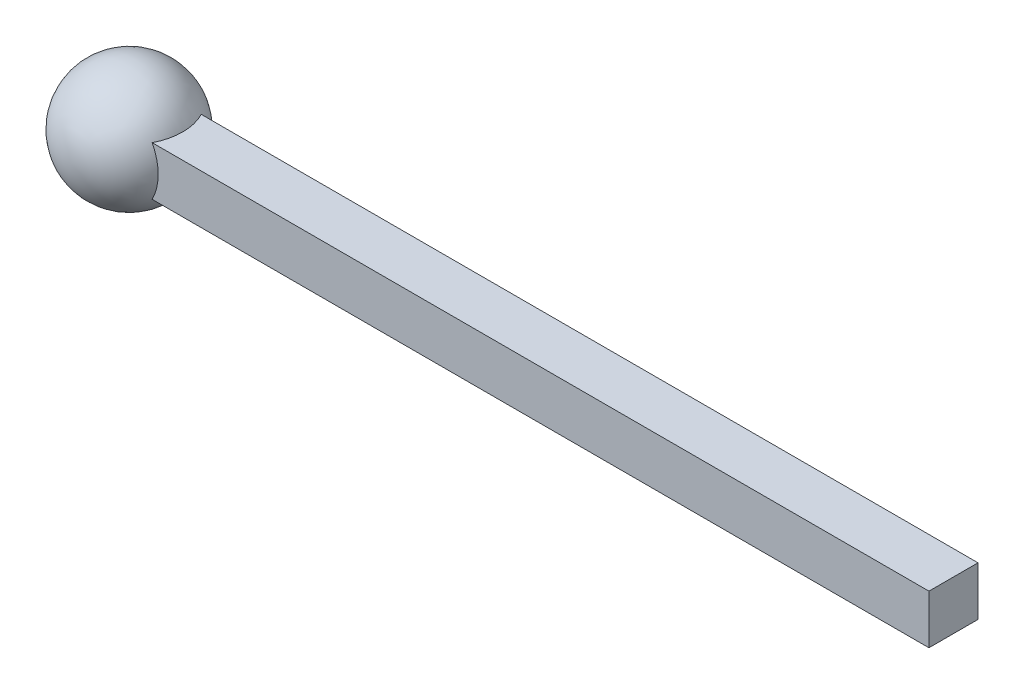
ISO-10303-21;
HEADER;
FILE_DESCRIPTION(('STEP AP214'),'2;1');
FILE_NAME('part.step','',(''),(''),'','','');
FILE_SCHEMA(('AUTOMOTIVE_DESIGN { 1 0 10303 214 1 1 1 1 }'));
ENDSEC;
DATA;
#1=APPLICATION_CONTEXT('core data for automotive mechanical design processes');
#2=APPLICATION_PROTOCOL_DEFINITION('international standard','automotive_design',2000,#1);
#3=PRODUCT_CONTEXT('',#1,'mechanical');
#4=PRODUCT('Part','Part','',(#3));
#5=PRODUCT_RELATED_PRODUCT_CATEGORY('part','',(#4));
#6=PRODUCT_DEFINITION_FORMATION('','',#4);
#7=PRODUCT_DEFINITION_CONTEXT('part definition',#1,'design');
#8=PRODUCT_DEFINITION('design','',#6,#7);
#9=PRODUCT_DEFINITION_SHAPE('','',#8);
#10=(LENGTH_UNIT() NAMED_UNIT(*) SI_UNIT(.MILLI.,.METRE.));
#11=(NAMED_UNIT(*) PLANE_ANGLE_UNIT() SI_UNIT($,.RADIAN.));
#12=(NAMED_UNIT(*) SI_UNIT($,.STERADIAN.) SOLID_ANGLE_UNIT());
#13=UNCERTAINTY_MEASURE_WITH_UNIT(LENGTH_MEASURE(1.E-05),#10,'distance_accuracy_value','');
#14=(GEOMETRIC_REPRESENTATION_CONTEXT(3) GLOBAL_UNCERTAINTY_ASSIGNED_CONTEXT((#13)) GLOBAL_UNIT_ASSIGNED_CONTEXT((#10,
#11,#12)) REPRESENTATION_CONTEXT('',''));
#15=CARTESIAN_POINT('',(0.,0.,0.));
#16=DIRECTION('',(0.,0.,1.));
#17=DIRECTION('',(1.,0.,0.));
#18=AXIS2_PLACEMENT_3D('',#15,#16,#17);
#19=CARTESIAN_POINT('',(561.061227952796,38.1,-190.5));
#20=DIRECTION('',(-1.,0.,0.));
#21=DIRECTION('',(0.,0.,1.));
#22=AXIS2_PLACEMENT_3D('',#19,#20,#21);
#23=PLANE('',#22);
#24=DIRECTION('',(0.,0.,1.));
#25=VECTOR('',#24,1.);
#26=CARTESIAN_POINT('',(561.061227952796,13.6071428571429,-166.007142857143));
#27=LINE('',#26,#25);
#28=CARTESIAN_POINT('',(561.061227952796,13.6071428571429,-166.007142857143));
#29=VERTEX_POINT('',#28);
#30=CARTESIAN_POINT('',(561.061227952796,13.6071428571428,-138.792857142857));
#31=VERTEX_POINT('',#30);
#32=EDGE_CURVE('E11',#29,#31,#27,.T.);
#33=ORIENTED_EDGE('',*,*,#32,.T.);
#34=DIRECTION('',(0.,-1.,0.));
#35=VECTOR('',#34,1.);
#36=CARTESIAN_POINT('',(561.061227952796,13.6071428571428,-138.792857142857));
#37=LINE('',#36,#35);
#38=CARTESIAN_POINT('',(561.061227952796,-13.6071428571429,-138.792857142857));
#39=VERTEX_POINT('',#38);
#40=EDGE_CURVE('E43',#31,#39,#37,.T.);
#41=ORIENTED_EDGE('',*,*,#40,.T.);
#42=DIRECTION('',(0.,0.,-1.));
#43=VECTOR('',#42,1.);
#44=CARTESIAN_POINT('',(561.061227952796,-13.6071428571429,-138.792857142857));
#45=LINE('',#44,#43);
#46=CARTESIAN_POINT('',(561.061227952796,-13.6071428571429,-166.007142857143));
#47=VERTEX_POINT('',#46);
#48=EDGE_CURVE('E51',#39,#47,#45,.T.);
#49=ORIENTED_EDGE('',*,*,#48,.T.);
#50=DIRECTION('',(0.,1.,0.));
#51=VECTOR('',#50,1.);
#52=CARTESIAN_POINT('',(561.061227952796,-13.6071428571429,-166.007142857143));
#53=LINE('',#52,#51);
#54=EDGE_CURVE('E93',#47,#29,#53,.T.);
#55=ORIENTED_EDGE('',*,*,#54,.T.);
#56=EDGE_LOOP('',(#33,#41,#49,#55));
#57=FACE_BOUND('',#56,.T.);
#58=ADVANCED_FACE('F35',(#57),#23,.F.);
#59=CARTESIAN_POINT('',(103.861227952796,0.,-152.4));
#60=DIRECTION('',(0.,0.,1.));
#61=DIRECTION('',(-1.,0.,0.));
#62=AXIS2_PLACEMENT_3D('',#59,#60,#61);
#63=SPHERICAL_SURFACE('',#62,32.6571428571429);
#64=CARTESIAN_POINT('',(103.861227952796,13.6071428571428,-152.4));
#65=DIRECTION('',(0.,1.,0.));
#66=DIRECTION('',(0.,0.,1.));
#67=AXIS2_PLACEMENT_3D('',#64,#65,#66);
#68=CIRCLE('',#67,29.6872808262586);
#69=CARTESIAN_POINT('',(130.246456891019,13.6071428571428,-138.792857142857));
#70=VERTEX_POINT('',#69);
#71=CARTESIAN_POINT('',(130.246456891019,13.6071428571429,-166.007142857143));
#72=VERTEX_POINT('',#71);
#73=EDGE_CURVE('E38',#70,#72,#68,.T.);
#74=ORIENTED_EDGE('',*,*,#73,.T.);
#75=CARTESIAN_POINT('',(103.861227952796,0.,-166.007142857143));
#76=DIRECTION('',(0.,0.,-1.));
#77=DIRECTION('',(-1.,0.,0.));
#78=AXIS2_PLACEMENT_3D('',#75,#76,#77);
#79=CIRCLE('',#78,29.6872808262586);
#80=CARTESIAN_POINT('',(130.246456891019,-13.6071428571429,-166.007142857143));
#81=VERTEX_POINT('',#80);
#82=EDGE_CURVE('E83',#72,#81,#79,.T.);
#83=ORIENTED_EDGE('',*,*,#82,.T.);
#84=CARTESIAN_POINT('',(103.861227952796,-13.6071428571429,-152.4));
#85=DIRECTION('',(0.,-1.,0.));
#86=DIRECTION('',(0.,0.,-1.));
#87=AXIS2_PLACEMENT_3D('',#84,#85,#86);
#88=CIRCLE('',#87,29.6872808262586);
#89=CARTESIAN_POINT('',(130.246456891019,-13.6071428571429,-138.792857142857));
#90=VERTEX_POINT('',#89);
#91=EDGE_CURVE('E77',#81,#90,#88,.T.);
#92=ORIENTED_EDGE('',*,*,#91,.T.);
#93=CARTESIAN_POINT('',(103.861227952796,0.,-138.792857142857));
#94=DIRECTION('',(0.,0.,1.));
#95=DIRECTION('',(0.,-1.,0.));
#96=AXIS2_PLACEMENT_3D('',#93,#94,#95);
#97=CIRCLE('',#96,29.6872808262586);
#98=EDGE_CURVE('E80',#90,#70,#97,.T.);
#99=ORIENTED_EDGE('',*,*,#98,.T.);
#100=EDGE_LOOP('',(#74,#83,#92,#99));
#101=FACE_BOUND('',#100,.T.);
#102=ADVANCED_FACE('F78',(#101),#63,.T.);
#103=CARTESIAN_POINT('',(71.2038708099387,13.6071428571429,-166.007142857143));
#104=DIRECTION('',(0.,1.,0.));
#105=DIRECTION('',(0.,0.,1.));
#106=AXIS2_PLACEMENT_3D('',#103,#104,#105);
#107=PLANE('',#106);
#108=ORIENTED_EDGE('',*,*,#73,.F.);
#109=DIRECTION('',(1.,0.,0.));
#110=VECTOR('',#109,1.);
#111=CARTESIAN_POINT('',(71.2038708099387,13.6071428571428,-138.792857142857));
#112=LINE('',#111,#110);
#113=EDGE_CURVE('E92',#70,#31,#112,.T.);
#114=ORIENTED_EDGE('',*,*,#113,.T.);
#115=ORIENTED_EDGE('',*,*,#32,.F.);
#116=DIRECTION('',(1.,0.,0.));
#117=VECTOR('',#116,1.);
#118=CARTESIAN_POINT('',(71.2038708099387,13.6071428571429,-166.007142857143));
#119=LINE('',#118,#117);
#120=EDGE_CURVE('E102',#72,#29,#119,.T.);
#121=ORIENTED_EDGE('',*,*,#120,.F.);
#122=EDGE_LOOP('',(#108,#114,#115,#121));
#123=FACE_BOUND('',#122,.T.);
#124=ADVANCED_FACE('F104',(#123),#107,.T.);
#125=CARTESIAN_POINT('',(71.2038708099387,-13.6071428571429,-166.007142857143));
#126=DIRECTION('',(0.,0.,-1.));
#127=DIRECTION('',(-1.,0.,0.));
#128=AXIS2_PLACEMENT_3D('',#125,#126,#127);
#129=PLANE('',#128);
#130=ORIENTED_EDGE('',*,*,#82,.F.);
#131=ORIENTED_EDGE('',*,*,#120,.T.);
#132=ORIENTED_EDGE('',*,*,#54,.F.);
#133=DIRECTION('',(1.,0.,0.));
#134=VECTOR('',#133,1.);
#135=CARTESIAN_POINT('',(71.2038708099387,-13.6071428571429,-166.007142857143));
#136=LINE('',#135,#134);
#137=EDGE_CURVE('E88',#81,#47,#136,.T.);
#138=ORIENTED_EDGE('',*,*,#137,.F.);
#139=EDGE_LOOP('',(#130,#131,#132,#138));
#140=FACE_BOUND('',#139,.T.);
#141=ADVANCED_FACE('F101',(#140),#129,.T.);
#142=CARTESIAN_POINT('',(71.2038708099387,-13.6071428571429,-138.792857142857));
#143=DIRECTION('',(0.,-1.,0.));
#144=DIRECTION('',(0.,0.,-1.));
#145=AXIS2_PLACEMENT_3D('',#142,#143,#144);
#146=PLANE('',#145);
#147=ORIENTED_EDGE('',*,*,#91,.F.);
#148=ORIENTED_EDGE('',*,*,#137,.T.);
#149=ORIENTED_EDGE('',*,*,#48,.F.);
#150=DIRECTION('',(1.,0.,0.));
#151=VECTOR('',#150,1.);
#152=CARTESIAN_POINT('',(71.2038708099387,-13.6071428571429,-138.792857142857));
#153=LINE('',#152,#151);
#154=EDGE_CURVE('E86',#90,#39,#153,.T.);
#155=ORIENTED_EDGE('',*,*,#154,.F.);
#156=EDGE_LOOP('',(#147,#148,#149,#155));
#157=FACE_BOUND('',#156,.T.);
#158=ADVANCED_FACE('F87',(#157),#146,.T.);
#159=CARTESIAN_POINT('',(71.2038708099387,13.6071428571428,-138.792857142857));
#160=DIRECTION('',(0.,0.,1.));
#161=DIRECTION('',(0.,-1.,0.));
#162=AXIS2_PLACEMENT_3D('',#159,#160,#161);
#163=PLANE('',#162);
#164=ORIENTED_EDGE('',*,*,#98,.F.);
#165=ORIENTED_EDGE('',*,*,#154,.T.);
#166=ORIENTED_EDGE('',*,*,#40,.F.);
#167=ORIENTED_EDGE('',*,*,#113,.F.);
#168=EDGE_LOOP('',(#164,#165,#166,#167));
#169=FACE_BOUND('',#168,.T.);
#170=ADVANCED_FACE('F90',(#169),#163,.T.);
#171=CLOSED_SHELL('',(#58,#102,#124,#141,#158,#170));
#172=MANIFOLD_SOLID_BREP('B2',#171);
#173=ADVANCED_BREP_SHAPE_REPRESENTATION('',(#18,#172),#14);
#174=SHAPE_DEFINITION_REPRESENTATION(#9,#173);
ENDSEC;
END-ISO-10303-21;
